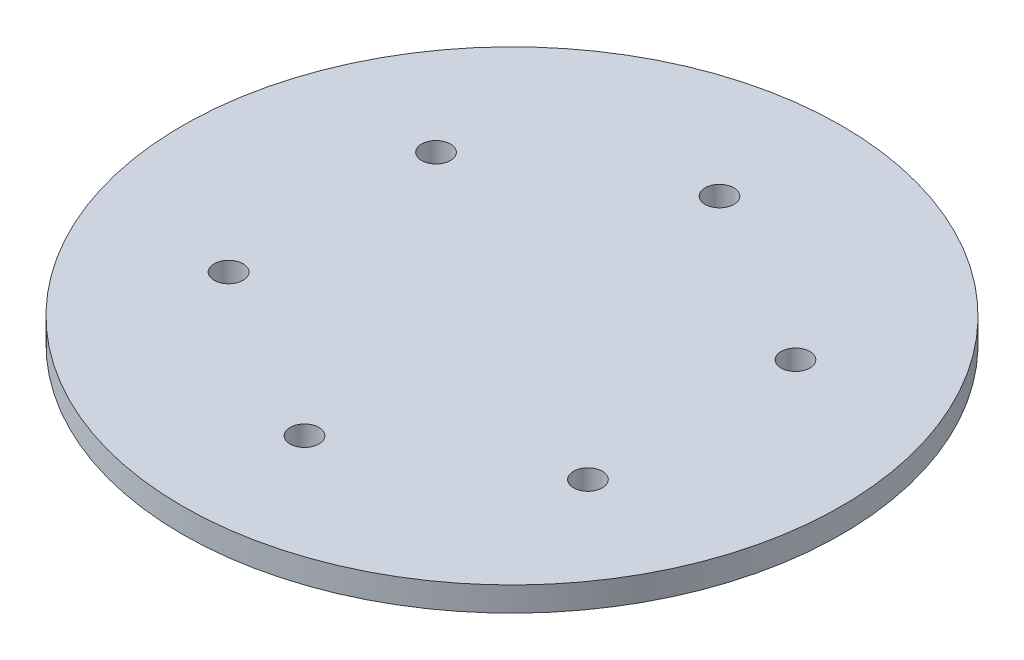
ISO-10303-21;
HEADER;
FILE_DESCRIPTION(('STEP AP214'),'2;1');
FILE_NAME('part.step','',(''),(''),'','','');
FILE_SCHEMA(('AUTOMOTIVE_DESIGN { 1 0 10303 214 1 1 1 1 }'));
ENDSEC;
DATA;
#1=APPLICATION_CONTEXT('core data for automotive mechanical design processes');
#2=APPLICATION_PROTOCOL_DEFINITION('international standard','automotive_design',2000,#1);
#3=PRODUCT_CONTEXT('',#1,'mechanical');
#4=PRODUCT('Part','Part','',(#3));
#5=PRODUCT_RELATED_PRODUCT_CATEGORY('part','',(#4));
#6=PRODUCT_DEFINITION_FORMATION('','',#4);
#7=PRODUCT_DEFINITION_CONTEXT('part definition',#1,'design');
#8=PRODUCT_DEFINITION('design','',#6,#7);
#9=PRODUCT_DEFINITION_SHAPE('','',#8);
#10=(LENGTH_UNIT() NAMED_UNIT(*) SI_UNIT(.MILLI.,.METRE.));
#11=(NAMED_UNIT(*) PLANE_ANGLE_UNIT() SI_UNIT($,.RADIAN.));
#12=(NAMED_UNIT(*) SI_UNIT($,.STERADIAN.) SOLID_ANGLE_UNIT());
#13=UNCERTAINTY_MEASURE_WITH_UNIT(LENGTH_MEASURE(1.E-05),#10,'distance_accuracy_value','');
#14=(GEOMETRIC_REPRESENTATION_CONTEXT(3) GLOBAL_UNCERTAINTY_ASSIGNED_CONTEXT((#13)) GLOBAL_UNIT_ASSIGNED_CONTEXT((#10,
#11,#12)) REPRESENTATION_CONTEXT('',''));
#15=CARTESIAN_POINT('',(0.,0.,0.));
#16=DIRECTION('',(0.,0.,1.));
#17=DIRECTION('',(1.,0.,0.));
#18=AXIS2_PLACEMENT_3D('',#15,#16,#17);
#19=CARTESIAN_POINT('',(0.,2.5,0.));
#20=DIRECTION('',(0.,-1.,0.));
#21=DIRECTION('',(0.,0.,-1.));
#22=AXIS2_PLACEMENT_3D('',#19,#20,#21);
#23=CYLINDRICAL_SURFACE('',#22,67.5);
#24=CARTESIAN_POINT('',(0.,2.5,0.));
#25=DIRECTION('',(0.,1.,0.));
#26=DIRECTION('',(0.,0.,1.));
#27=AXIS2_PLACEMENT_3D('',#24,#25,#26);
#28=CIRCLE('',#27,67.5);
#29=CARTESIAN_POINT('',(0.,2.5,67.5));
#30=VERTEX_POINT('',#29);
#31=EDGE_CURVE('E10',#30,#30,#28,.T.);
#32=ORIENTED_EDGE('',*,*,#31,.F.);
#33=EDGE_LOOP('',(#32));
#34=FACE_BOUND('',#33,.T.);
#35=CARTESIAN_POINT('',(0.,-2.5,0.));
#36=DIRECTION('',(0.,1.,0.));
#37=DIRECTION('',(0.,0.,1.));
#38=AXIS2_PLACEMENT_3D('',#35,#36,#37);
#39=CIRCLE('',#38,67.5);
#40=CARTESIAN_POINT('',(0.,-2.5,67.5));
#41=VERTEX_POINT('',#40);
#42=EDGE_CURVE('E42',#41,#41,#39,.T.);
#43=ORIENTED_EDGE('',*,*,#42,.T.);
#44=EDGE_LOOP('',(#43));
#45=FACE_BOUND('',#44,.T.);
#46=ADVANCED_FACE('F39',(#34,#45),#23,.T.);
#47=CARTESIAN_POINT('',(0.,2.5,0.));
#48=DIRECTION('',(0.,1.,0.));
#49=DIRECTION('',(0.,0.,1.));
#50=AXIS2_PLACEMENT_3D('',#47,#48,#49);
#51=PLANE('',#50);
#52=CARTESIAN_POINT('',(0.,2.5,-42.5));
#53=DIRECTION('',(0.,1.,0.));
#54=DIRECTION('',(0.,0.,1.));
#55=AXIS2_PLACEMENT_3D('',#52,#53,#54);
#56=CIRCLE('',#55,2.95);
#57=CARTESIAN_POINT('',(0.,2.5,-39.55));
#58=VERTEX_POINT('',#57);
#59=EDGE_CURVE('E76',#58,#58,#56,.T.);
#60=ORIENTED_EDGE('',*,*,#59,.F.);
#61=EDGE_LOOP('',(#60));
#62=FACE_BOUND('',#61,.T.);
#63=CARTESIAN_POINT('',(-36.8060796608371,2.5,-21.2499999999972));
#64=DIRECTION('',(0.,1.,0.));
#65=DIRECTION('',(0.,0.,1.));
#66=AXIS2_PLACEMENT_3D('',#63,#64,#65);
#67=CIRCLE('',#66,2.95);
#68=CARTESIAN_POINT('',(-36.8060796608371,2.5,-18.2999999999972));
#69=VERTEX_POINT('',#68);
#70=EDGE_CURVE('E55',#69,#69,#67,.T.);
#71=ORIENTED_EDGE('',*,*,#70,.F.);
#72=EDGE_LOOP('',(#71));
#73=FACE_BOUND('',#72,.T.);
#74=CARTESIAN_POINT('',(-36.8060796608339,2.5,21.2500000000028));
#75=DIRECTION('',(0.,1.,0.));
#76=DIRECTION('',(0.,0.,1.));
#77=AXIS2_PLACEMENT_3D('',#74,#75,#76);
#78=CIRCLE('',#77,2.95);
#79=CARTESIAN_POINT('',(-36.8060796608339,2.5,24.2000000000028));
#80=VERTEX_POINT('',#79);
#81=EDGE_CURVE('E54',#80,#80,#78,.T.);
#82=ORIENTED_EDGE('',*,*,#81,.F.);
#83=EDGE_LOOP('',(#82));
#84=FACE_BOUND('',#83,.T.);
#85=CARTESIAN_POINT('',(6.35897816463561E-12,2.5,42.5));
#86=DIRECTION('',(0.,1.,0.));
#87=DIRECTION('',(0.,0.,1.));
#88=AXIS2_PLACEMENT_3D('',#85,#86,#87);
#89=CIRCLE('',#88,2.95);
#90=CARTESIAN_POINT('',(6.35897816463561E-12,2.5,45.45));
#91=VERTEX_POINT('',#90);
#92=EDGE_CURVE('E61',#91,#91,#89,.T.);
#93=ORIENTED_EDGE('',*,*,#92,.F.);
#94=EDGE_LOOP('',(#93));
#95=FACE_BOUND('',#94,.T.);
#96=CARTESIAN_POINT('',(36.8060796608434,2.5,21.2499999999972));
#97=DIRECTION('',(0.,1.,0.));
#98=DIRECTION('',(0.,0.,1.));
#99=AXIS2_PLACEMENT_3D('',#96,#97,#98);
#100=CIRCLE('',#99,2.95);
#101=CARTESIAN_POINT('',(36.8060796608434,2.5,24.1999999999972));
#102=VERTEX_POINT('',#101);
#103=EDGE_CURVE('E67',#102,#102,#100,.T.);
#104=ORIENTED_EDGE('',*,*,#103,.F.);
#105=EDGE_LOOP('',(#104));
#106=FACE_BOUND('',#105,.T.);
#107=CARTESIAN_POINT('',(36.8060796608402,2.5,-21.2500000000028));
#108=DIRECTION('',(0.,1.,0.));
#109=DIRECTION('',(0.,0.,1.));
#110=AXIS2_PLACEMENT_3D('',#107,#108,#109);
#111=CIRCLE('',#110,2.95);
#112=CARTESIAN_POINT('',(36.8060796608402,2.5,-18.3000000000028));
#113=VERTEX_POINT('',#112);
#114=EDGE_CURVE('E73',#113,#113,#111,.T.);
#115=ORIENTED_EDGE('',*,*,#114,.F.);
#116=EDGE_LOOP('',(#115));
#117=FACE_BOUND('',#116,.T.);
#118=ORIENTED_EDGE('',*,*,#31,.T.);
#119=EDGE_LOOP('',(#118));
#120=FACE_BOUND('',#119,.T.);
#121=ADVANCED_FACE('F97',(#62,#73,#84,#95,#106,#117,#120),#51,.T.);
#122=CARTESIAN_POINT('',(0.,-2.5,0.));
#123=DIRECTION('',(0.,1.,0.));
#124=DIRECTION('',(0.,0.,1.));
#125=AXIS2_PLACEMENT_3D('',#122,#123,#124);
#126=PLANE('',#125);
#127=CARTESIAN_POINT('',(0.,-2.5,-42.5));
#128=DIRECTION('',(0.,1.,0.));
#129=DIRECTION('',(0.,0.,1.));
#130=AXIS2_PLACEMENT_3D('',#127,#128,#129);
#131=CIRCLE('',#130,2.95);
#132=CARTESIAN_POINT('',(0.,-2.5,-39.55));
#133=VERTEX_POINT('',#132);
#134=EDGE_CURVE('E49',#133,#133,#131,.T.);
#135=ORIENTED_EDGE('',*,*,#134,.T.);
#136=EDGE_LOOP('',(#135));
#137=FACE_BOUND('',#136,.T.);
#138=CARTESIAN_POINT('',(-36.8060796608371,-2.5,-21.2499999999972));
#139=DIRECTION('',(0.,1.,0.));
#140=DIRECTION('',(0.,0.,1.));
#141=AXIS2_PLACEMENT_3D('',#138,#139,#140);
#142=CIRCLE('',#141,2.95);
#143=CARTESIAN_POINT('',(-36.8060796608371,-2.5,-18.2999999999972));
#144=VERTEX_POINT('',#143);
#145=EDGE_CURVE('E77',#144,#144,#142,.T.);
#146=ORIENTED_EDGE('',*,*,#145,.T.);
#147=EDGE_LOOP('',(#146));
#148=FACE_BOUND('',#147,.T.);
#149=CARTESIAN_POINT('',(-36.8060796608339,-2.5,21.2500000000028));
#150=DIRECTION('',(0.,1.,0.));
#151=DIRECTION('',(0.,0.,1.));
#152=AXIS2_PLACEMENT_3D('',#149,#150,#151);
#153=CIRCLE('',#152,2.95);
#154=CARTESIAN_POINT('',(-36.8060796608339,-2.5,24.2000000000028));
#155=VERTEX_POINT('',#154);
#156=EDGE_CURVE('E51',#155,#155,#153,.T.);
#157=ORIENTED_EDGE('',*,*,#156,.T.);
#158=EDGE_LOOP('',(#157));
#159=FACE_BOUND('',#158,.T.);
#160=CARTESIAN_POINT('',(6.35897816463561E-12,-2.5,42.5));
#161=DIRECTION('',(0.,1.,0.));
#162=DIRECTION('',(0.,0.,1.));
#163=AXIS2_PLACEMENT_3D('',#160,#161,#162);
#164=CIRCLE('',#163,2.95);
#165=CARTESIAN_POINT('',(6.35897816463561E-12,-2.5,45.45));
#166=VERTEX_POINT('',#165);
#167=EDGE_CURVE('E58',#166,#166,#164,.T.);
#168=ORIENTED_EDGE('',*,*,#167,.T.);
#169=EDGE_LOOP('',(#168));
#170=FACE_BOUND('',#169,.T.);
#171=CARTESIAN_POINT('',(36.8060796608434,-2.5,21.2499999999972));
#172=DIRECTION('',(0.,1.,0.));
#173=DIRECTION('',(0.,0.,1.));
#174=AXIS2_PLACEMENT_3D('',#171,#172,#173);
#175=CIRCLE('',#174,2.95);
#176=CARTESIAN_POINT('',(36.8060796608434,-2.5,24.1999999999972));
#177=VERTEX_POINT('',#176);
#178=EDGE_CURVE('E64',#177,#177,#175,.T.);
#179=ORIENTED_EDGE('',*,*,#178,.T.);
#180=EDGE_LOOP('',(#179));
#181=FACE_BOUND('',#180,.T.);
#182=CARTESIAN_POINT('',(36.8060796608402,-2.5,-21.2500000000028));
#183=DIRECTION('',(0.,1.,0.));
#184=DIRECTION('',(0.,0.,1.));
#185=AXIS2_PLACEMENT_3D('',#182,#183,#184);
#186=CIRCLE('',#185,2.95);
#187=CARTESIAN_POINT('',(36.8060796608402,-2.5,-18.3000000000028));
#188=VERTEX_POINT('',#187);
#189=EDGE_CURVE('E70',#188,#188,#186,.T.);
#190=ORIENTED_EDGE('',*,*,#189,.T.);
#191=EDGE_LOOP('',(#190));
#192=FACE_BOUND('',#191,.T.);
#193=ORIENTED_EDGE('',*,*,#42,.F.);
#194=EDGE_LOOP('',(#193));
#195=FACE_BOUND('',#194,.T.);
#196=ADVANCED_FACE('F87',(#137,#148,#159,#170,#181,#192,#195),#126,.F.);
#197=CARTESIAN_POINT('',(36.8060796608402,-2.5,-21.2500000000028));
#198=DIRECTION('',(0.,1.,0.));
#199=DIRECTION('',(0.,0.,1.));
#200=AXIS2_PLACEMENT_3D('',#197,#198,#199);
#201=CYLINDRICAL_SURFACE('',#200,2.95);
#202=ORIENTED_EDGE('',*,*,#189,.F.);
#203=EDGE_LOOP('',(#202));
#204=FACE_BOUND('',#203,.T.);
#205=ORIENTED_EDGE('',*,*,#114,.T.);
#206=EDGE_LOOP('',(#205));
#207=FACE_BOUND('',#206,.T.);
#208=ADVANCED_FACE('F111',(#204,#207),#201,.F.);
#209=CARTESIAN_POINT('',(36.8060796608434,-2.5,21.2499999999972));
#210=DIRECTION('',(0.,1.,0.));
#211=DIRECTION('',(0.,0.,1.));
#212=AXIS2_PLACEMENT_3D('',#209,#210,#211);
#213=CYLINDRICAL_SURFACE('',#212,2.95);
#214=ORIENTED_EDGE('',*,*,#178,.F.);
#215=EDGE_LOOP('',(#214));
#216=FACE_BOUND('',#215,.T.);
#217=ORIENTED_EDGE('',*,*,#103,.T.);
#218=EDGE_LOOP('',(#217));
#219=FACE_BOUND('',#218,.T.);
#220=ADVANCED_FACE('F113',(#216,#219),#213,.F.);
#221=CARTESIAN_POINT('',(6.35897816463561E-12,-2.5,42.5));
#222=DIRECTION('',(0.,1.,0.));
#223=DIRECTION('',(0.,0.,1.));
#224=AXIS2_PLACEMENT_3D('',#221,#222,#223);
#225=CYLINDRICAL_SURFACE('',#224,2.95);
#226=ORIENTED_EDGE('',*,*,#167,.F.);
#227=EDGE_LOOP('',(#226));
#228=FACE_BOUND('',#227,.T.);
#229=ORIENTED_EDGE('',*,*,#92,.T.);
#230=EDGE_LOOP('',(#229));
#231=FACE_BOUND('',#230,.T.);
#232=ADVANCED_FACE('F120',(#228,#231),#225,.F.);
#233=CARTESIAN_POINT('',(-36.8060796608339,-2.5,21.2500000000028));
#234=DIRECTION('',(0.,1.,0.));
#235=DIRECTION('',(0.,0.,1.));
#236=AXIS2_PLACEMENT_3D('',#233,#234,#235);
#237=CYLINDRICAL_SURFACE('',#236,2.95);
#238=ORIENTED_EDGE('',*,*,#156,.F.);
#239=EDGE_LOOP('',(#238));
#240=FACE_BOUND('',#239,.T.);
#241=ORIENTED_EDGE('',*,*,#81,.T.);
#242=EDGE_LOOP('',(#241));
#243=FACE_BOUND('',#242,.T.);
#244=ADVANCED_FACE('F162',(#240,#243),#237,.F.);
#245=CARTESIAN_POINT('',(-36.8060796608371,-2.5,-21.2499999999972));
#246=DIRECTION('',(0.,1.,0.));
#247=DIRECTION('',(0.,0.,1.));
#248=AXIS2_PLACEMENT_3D('',#245,#246,#247);
#249=CYLINDRICAL_SURFACE('',#248,2.95);
#250=ORIENTED_EDGE('',*,*,#145,.F.);
#251=EDGE_LOOP('',(#250));
#252=FACE_BOUND('',#251,.T.);
#253=ORIENTED_EDGE('',*,*,#70,.T.);
#254=EDGE_LOOP('',(#253));
#255=FACE_BOUND('',#254,.T.);
#256=ADVANCED_FACE('F93',(#252,#255),#249,.F.);
#257=CARTESIAN_POINT('',(0.,-2.5,-42.5));
#258=DIRECTION('',(0.,1.,0.));
#259=DIRECTION('',(0.,0.,1.));
#260=AXIS2_PLACEMENT_3D('',#257,#258,#259);
#261=CYLINDRICAL_SURFACE('',#260,2.95);
#262=ORIENTED_EDGE('',*,*,#134,.F.);
#263=EDGE_LOOP('',(#262));
#264=FACE_BOUND('',#263,.T.);
#265=ORIENTED_EDGE('',*,*,#59,.T.);
#266=EDGE_LOOP('',(#265));
#267=FACE_BOUND('',#266,.T.);
#268=ADVANCED_FACE('F90',(#264,#267),#261,.F.);
#269=CLOSED_SHELL('',(#46,#121,#196,#208,#220,#232,#244,#256,#268));
#270=MANIFOLD_SOLID_BREP('B2',#269);
#271=ADVANCED_BREP_SHAPE_REPRESENTATION('',(#18,#270),#14);
#272=SHAPE_DEFINITION_REPRESENTATION(#9,#271);
ENDSEC;
END-ISO-10303-21;
